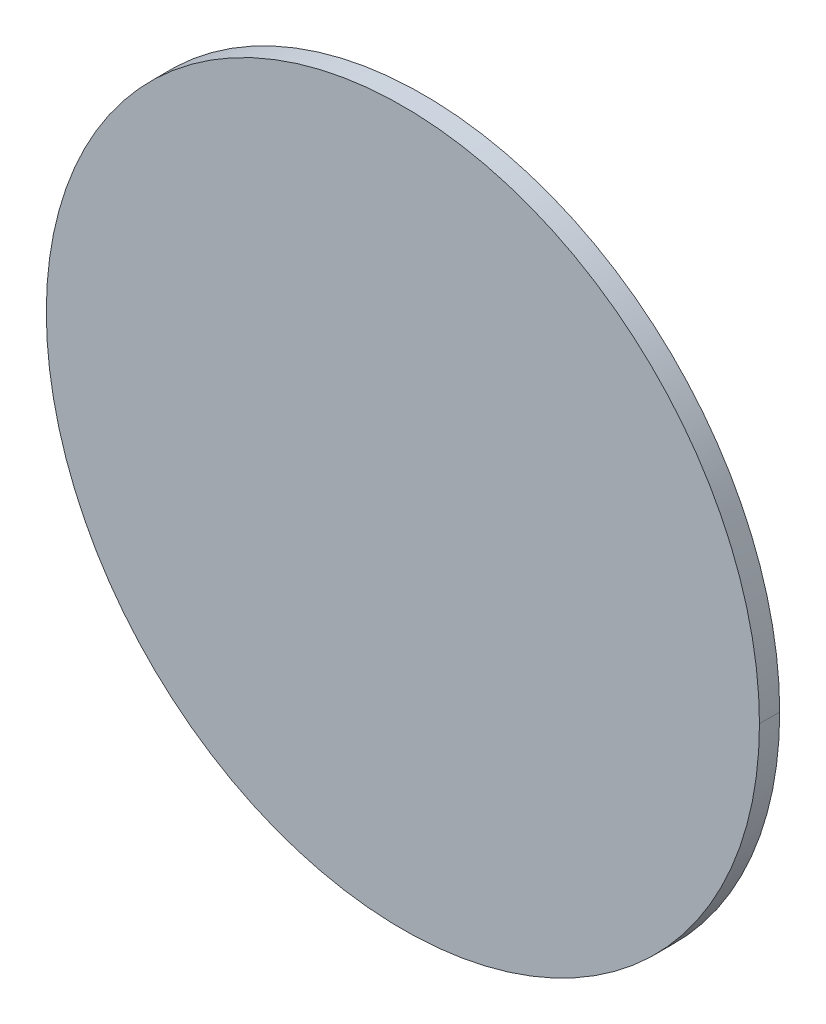
ISO-10303-21;
HEADER;
FILE_DESCRIPTION(('STEP AP214'),'2;1');
FILE_NAME('part.step','',(''),(''),'','','');
FILE_SCHEMA(('AUTOMOTIVE_DESIGN { 1 0 10303 214 1 1 1 1 }'));
ENDSEC;
DATA;
#1=APPLICATION_CONTEXT('core data for automotive mechanical design processes');
#2=APPLICATION_PROTOCOL_DEFINITION('international standard','automotive_design',2000,#1);
#3=PRODUCT_CONTEXT('',#1,'mechanical');
#4=PRODUCT('Part','Part','',(#3));
#5=PRODUCT_RELATED_PRODUCT_CATEGORY('part','',(#4));
#6=PRODUCT_DEFINITION_FORMATION('','',#4);
#7=PRODUCT_DEFINITION_CONTEXT('part definition',#1,'design');
#8=PRODUCT_DEFINITION('design','',#6,#7);
#9=PRODUCT_DEFINITION_SHAPE('','',#8);
#10=(LENGTH_UNIT() NAMED_UNIT(*) SI_UNIT(.MILLI.,.METRE.));
#11=(NAMED_UNIT(*) PLANE_ANGLE_UNIT() SI_UNIT($,.RADIAN.));
#12=(NAMED_UNIT(*) SI_UNIT($,.STERADIAN.) SOLID_ANGLE_UNIT());
#13=UNCERTAINTY_MEASURE_WITH_UNIT(LENGTH_MEASURE(1.E-05),#10,'distance_accuracy_value','');
#14=(GEOMETRIC_REPRESENTATION_CONTEXT(3) GLOBAL_UNCERTAINTY_ASSIGNED_CONTEXT((#13)) GLOBAL_UNIT_ASSIGNED_CONTEXT((#10,
#11,#12)) REPRESENTATION_CONTEXT('',''));
#15=CARTESIAN_POINT('',(0.,0.,0.));
#16=DIRECTION('',(0.,0.,1.));
#17=DIRECTION('',(1.,0.,0.));
#18=AXIS2_PLACEMENT_3D('',#15,#16,#17);
#19=CARTESIAN_POINT('',(10.892499389648,47.569998555611,0.0127));
#20=DIRECTION('',(0.,0.,1.));
#21=DIRECTION('',(1.,0.,0.));
#22=AXIS2_PLACEMENT_3D('',#19,#20,#21);
#23=PLANE('',#22);
#24=CARTESIAN_POINT('',(10.892499389648,47.569998555611,0.0127));
#25=DIRECTION('',(0.,0.,-1.));
#26=DIRECTION('',(1.,0.,0.));
#27=AXIS2_PLACEMENT_3D('',#24,#25,#26);
#28=CIRCLE('',#27,0.223600077202);
#29=CARTESIAN_POINT('',(11.116099466851,47.569998555611,0.0127));
#30=VERTEX_POINT('',#29);
#31=CARTESIAN_POINT('',(10.668899312446,47.569998555611,0.0127));
#32=VERTEX_POINT('',#31);
#33=EDGE_CURVE('E11',#30,#32,#28,.T.);
#34=ORIENTED_EDGE('',*,*,#33,.F.);
#35=CARTESIAN_POINT('',(10.892499389648,47.569998555611,0.0127));
#36=DIRECTION('',(0.,0.,-1.));
#37=DIRECTION('',(1.,0.,0.));
#38=AXIS2_PLACEMENT_3D('',#35,#36,#37);
#39=CIRCLE('',#38,0.223600077202);
#40=EDGE_CURVE('E64',#32,#30,#39,.T.);
#41=ORIENTED_EDGE('',*,*,#40,.F.);
#42=EDGE_LOOP('',(#34,#41));
#43=FACE_BOUND('',#42,.T.);
#44=ADVANCED_FACE('F17',(#43),#23,.T.);
#45=CARTESIAN_POINT('',(10.892499389648,47.569998555611,0.));
#46=DIRECTION('',(0.,0.,1.));
#47=DIRECTION('',(1.,0.,0.));
#48=AXIS2_PLACEMENT_3D('',#45,#46,#47);
#49=CYLINDRICAL_SURFACE('',#48,0.223600077202);
#50=DIRECTION('',(0.,0.,1.));
#51=VECTOR('',#50,1.);
#52=CARTESIAN_POINT('',(10.668899312446,47.569998555611,0.));
#53=LINE('',#52,#51);
#54=CARTESIAN_POINT('',(10.668899312446,47.569998555611,0.));
#55=VERTEX_POINT('',#54);
#56=EDGE_CURVE('E59',#55,#32,#53,.T.);
#57=ORIENTED_EDGE('',*,*,#56,.F.);
#58=CARTESIAN_POINT('',(10.892499389648,47.569998555611,0.));
#59=DIRECTION('',(0.,0.,1.));
#60=DIRECTION('',(1.,0.,0.));
#61=AXIS2_PLACEMENT_3D('',#58,#59,#60);
#62=CIRCLE('',#61,0.223600077202);
#63=CARTESIAN_POINT('',(11.116099466851,47.569998555611,0.));
#64=VERTEX_POINT('',#63);
#65=EDGE_CURVE('E28',#55,#64,#62,.T.);
#66=ORIENTED_EDGE('',*,*,#65,.T.);
#67=DIRECTION('',(0.,0.,1.));
#68=VECTOR('',#67,1.);
#69=CARTESIAN_POINT('',(11.116099466851,47.569998555611,0.));
#70=LINE('',#69,#68);
#71=EDGE_CURVE('E21',#64,#30,#70,.T.);
#72=ORIENTED_EDGE('',*,*,#71,.T.);
#73=ORIENTED_EDGE('',*,*,#33,.T.);
#74=EDGE_LOOP('',(#57,#66,#72,#73));
#75=FACE_BOUND('',#74,.T.);
#76=ADVANCED_FACE('F60',(#75),#49,.T.);
#77=CARTESIAN_POINT('',(10.892499389648,47.569998555611,0.));
#78=DIRECTION('',(0.,0.,1.));
#79=DIRECTION('',(1.,0.,0.));
#80=AXIS2_PLACEMENT_3D('',#77,#78,#79);
#81=PLANE('',#80);
#82=CARTESIAN_POINT('',(10.892499389648,47.569998555611,0.));
#83=DIRECTION('',(0.,0.,1.));
#84=DIRECTION('',(1.,0.,0.));
#85=AXIS2_PLACEMENT_3D('',#82,#83,#84);
#86=CIRCLE('',#85,0.223600077202);
#87=EDGE_CURVE('E55',#64,#55,#86,.T.);
#88=ORIENTED_EDGE('',*,*,#87,.F.);
#89=ORIENTED_EDGE('',*,*,#65,.F.);
#90=EDGE_LOOP('',(#88,#89));
#91=FACE_BOUND('',#90,.T.);
#92=ADVANCED_FACE('F19',(#91),#81,.F.);
#93=CARTESIAN_POINT('',(10.892499389648,47.569998555611,0.));
#94=DIRECTION('',(0.,0.,1.));
#95=DIRECTION('',(1.,0.,0.));
#96=AXIS2_PLACEMENT_3D('',#93,#94,#95);
#97=CYLINDRICAL_SURFACE('',#96,0.223600077202);
#98=ORIENTED_EDGE('',*,*,#87,.T.);
#99=ORIENTED_EDGE('',*,*,#56,.T.);
#100=ORIENTED_EDGE('',*,*,#40,.T.);
#101=ORIENTED_EDGE('',*,*,#71,.F.);
#102=EDGE_LOOP('',(#98,#99,#100,#101));
#103=FACE_BOUND('',#102,.T.);
#104=ADVANCED_FACE('F66',(#103),#97,.T.);
#105=CLOSED_SHELL('',(#44,#76,#92,#104));
#106=MANIFOLD_SOLID_BREP('B1',#105);
#107=ADVANCED_BREP_SHAPE_REPRESENTATION('',(#18,#106),#14);
#108=SHAPE_DEFINITION_REPRESENTATION(#9,#107);
ENDSEC;
END-ISO-10303-21;
